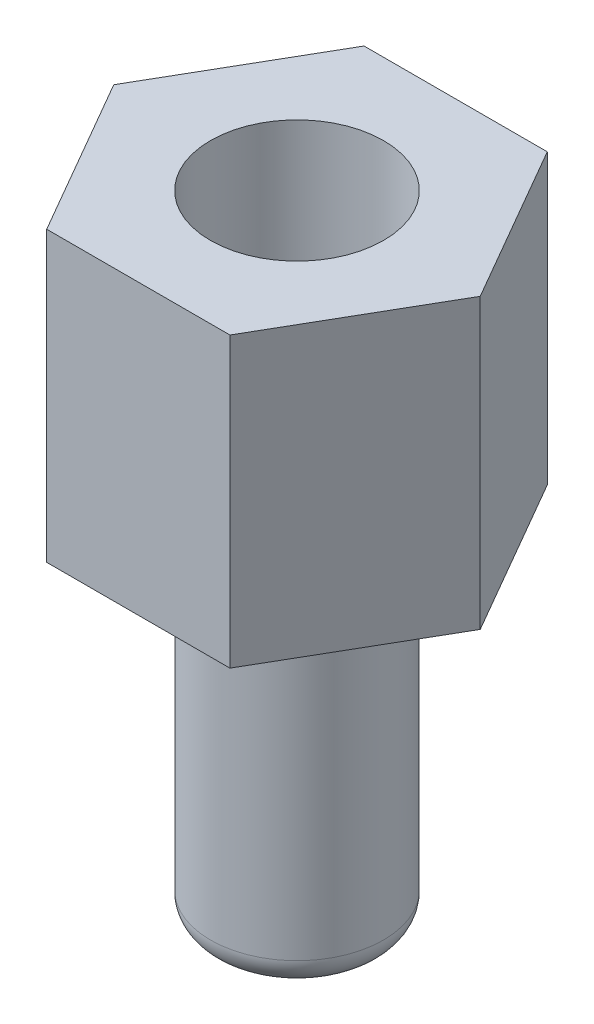
ISO-10303-21;
HEADER;
FILE_DESCRIPTION(('STEP AP214'),'2;1');
FILE_NAME('part.step','',(''),(''),'','','');
FILE_SCHEMA(('AUTOMOTIVE_DESIGN { 1 0 10303 214 1 1 1 1 }'));
ENDSEC;
DATA;
#1=APPLICATION_CONTEXT('core data for automotive mechanical design processes');
#2=APPLICATION_PROTOCOL_DEFINITION('international standard','automotive_design',2000,#1);
#3=PRODUCT_CONTEXT('',#1,'mechanical');
#4=PRODUCT('Part','Part','',(#3));
#5=PRODUCT_RELATED_PRODUCT_CATEGORY('part','',(#4));
#6=PRODUCT_DEFINITION_FORMATION('','',#4);
#7=PRODUCT_DEFINITION_CONTEXT('part definition',#1,'design');
#8=PRODUCT_DEFINITION('design','',#6,#7);
#9=PRODUCT_DEFINITION_SHAPE('','',#8);
#10=(LENGTH_UNIT() NAMED_UNIT(*) SI_UNIT(.MILLI.,.METRE.));
#11=(NAMED_UNIT(*) PLANE_ANGLE_UNIT() SI_UNIT($,.RADIAN.));
#12=(NAMED_UNIT(*) SI_UNIT($,.STERADIAN.) SOLID_ANGLE_UNIT());
#13=UNCERTAINTY_MEASURE_WITH_UNIT(LENGTH_MEASURE(1.E-05),#10,'distance_accuracy_value','');
#14=(GEOMETRIC_REPRESENTATION_CONTEXT(3) GLOBAL_UNCERTAINTY_ASSIGNED_CONTEXT((#13)) GLOBAL_UNIT_ASSIGNED_CONTEXT((#10,
#11,#12)) REPRESENTATION_CONTEXT('',''));
#15=CARTESIAN_POINT('',(0.,0.,0.));
#16=DIRECTION('',(0.,0.,1.));
#17=DIRECTION('',(1.,0.,0.));
#18=AXIS2_PLACEMENT_3D('',#15,#16,#17);
#19=CARTESIAN_POINT('',(0.,0.,0.));
#20=DIRECTION('',(0.,1.,0.));
#21=DIRECTION('',(0.,0.,1.));
#22=AXIS2_PLACEMENT_3D('',#19,#20,#21);
#23=PLANE('',#22);
#24=DIRECTION('',(0.5,0.,-0.866025403784439));
#25=VECTOR('',#24,1.);
#26=CARTESIAN_POINT('',(1.58771324027146,0.,2.75000000000001));
#27=LINE('',#26,#25);
#28=CARTESIAN_POINT('',(1.58771324027146,0.,2.75000000000001));
#29=VERTEX_POINT('',#28);
#30=CARTESIAN_POINT('',(3.17542648054294,0.,0.));
#31=VERTEX_POINT('',#30);
#32=EDGE_CURVE('E119',#29,#31,#27,.T.);
#33=ORIENTED_EDGE('',*,*,#32,.F.);
#34=DIRECTION('',(1.,0.,0.));
#35=VECTOR('',#34,1.);
#36=CARTESIAN_POINT('',(-1.58771324027148,0.,2.75000000000001));
#37=LINE('',#36,#35);
#38=CARTESIAN_POINT('',(-1.58771324027148,0.,2.75000000000001));
#39=VERTEX_POINT('',#38);
#40=EDGE_CURVE('E79',#39,#29,#37,.T.);
#41=ORIENTED_EDGE('',*,*,#40,.F.);
#42=DIRECTION('',(0.5,0.,0.866025403784439));
#43=VECTOR('',#42,1.);
#44=CARTESIAN_POINT('',(-3.17542648054295,0.,0.));
#45=LINE('',#44,#43);
#46=CARTESIAN_POINT('',(-3.17542648054295,0.,0.));
#47=VERTEX_POINT('',#46);
#48=EDGE_CURVE('E73',#47,#39,#45,.T.);
#49=ORIENTED_EDGE('',*,*,#48,.F.);
#50=DIRECTION('',(-0.500000000000001,0.,0.866025403784438));
#51=VECTOR('',#50,1.);
#52=CARTESIAN_POINT('',(-1.58771324027147,0.,-2.75));
#53=LINE('',#52,#51);
#54=CARTESIAN_POINT('',(-1.58771324027147,0.,-2.75));
#55=VERTEX_POINT('',#54);
#56=EDGE_CURVE('E109',#55,#47,#53,.T.);
#57=ORIENTED_EDGE('',*,*,#56,.F.);
#58=DIRECTION('',(-1.,0.,0.));
#59=VECTOR('',#58,1.);
#60=CARTESIAN_POINT('',(1.58771324027146,0.,-2.75));
#61=LINE('',#60,#59);
#62=CARTESIAN_POINT('',(1.58771324027146,0.,-2.75));
#63=VERTEX_POINT('',#62);
#64=EDGE_CURVE('E125',#63,#55,#61,.T.);
#65=ORIENTED_EDGE('',*,*,#64,.F.);
#66=DIRECTION('',(-0.500000000000001,0.,-0.866025403784438));
#67=VECTOR('',#66,1.);
#68=CARTESIAN_POINT('',(3.17542648054294,0.,0.));
#69=LINE('',#68,#67);
#70=EDGE_CURVE('E122',#31,#63,#69,.T.);
#71=ORIENTED_EDGE('',*,*,#70,.F.);
#72=EDGE_LOOP('',(#33,#41,#49,#57,#65,#71));
#73=FACE_BOUND('',#72,.T.);
#74=CARTESIAN_POINT('',(0.,0.,0.));
#75=DIRECTION('',(0.,1.,0.));
#76=DIRECTION('',(0.,0.,1.));
#77=AXIS2_PLACEMENT_3D('',#74,#75,#76);
#78=CIRCLE('',#77,1.5);
#79=CARTESIAN_POINT('',(0.,0.,1.5));
#80=VERTEX_POINT('',#79);
#81=EDGE_CURVE('E139',#80,#80,#78,.F.);
#82=ORIENTED_EDGE('',*,*,#81,.F.);
#83=EDGE_LOOP('',(#82));
#84=FACE_BOUND('',#83,.T.);
#85=ADVANCED_FACE('F33',(#73,#84),#23,.F.);
#86=CARTESIAN_POINT('',(1.58771324027146,5.,2.75000000000001));
#87=DIRECTION('',(-0.866025403784438,0.,-0.5));
#88=DIRECTION('',(-0.5,0.,0.866025403784438));
#89=AXIS2_PLACEMENT_3D('',#86,#87,#88);
#90=PLANE('',#89);
#91=ORIENTED_EDGE('',*,*,#32,.T.);
#92=DIRECTION('',(0.,-1.,0.));
#93=VECTOR('',#92,1.);
#94=CARTESIAN_POINT('',(3.17542648054294,5.,0.));
#95=LINE('',#94,#93);
#96=CARTESIAN_POINT('',(3.17542648054294,5.,0.));
#97=VERTEX_POINT('',#96);
#98=EDGE_CURVE('E137',#97,#31,#95,.T.);
#99=ORIENTED_EDGE('',*,*,#98,.F.);
#100=DIRECTION('',(0.5,0.,-0.866025403784439));
#101=VECTOR('',#100,1.);
#102=CARTESIAN_POINT('',(1.58771324027146,5.,2.75000000000001));
#103=LINE('',#102,#101);
#104=CARTESIAN_POINT('',(1.58771324027146,5.,2.75000000000001));
#105=VERTEX_POINT('',#104);
#106=EDGE_CURVE('E130',#105,#97,#103,.T.);
#107=ORIENTED_EDGE('',*,*,#106,.F.);
#108=DIRECTION('',(0.,-1.,0.));
#109=VECTOR('',#108,1.);
#110=CARTESIAN_POINT('',(1.58771324027146,5.,2.75000000000001));
#111=LINE('',#110,#109);
#112=EDGE_CURVE('E115',#105,#29,#111,.T.);
#113=ORIENTED_EDGE('',*,*,#112,.T.);
#114=EDGE_LOOP('',(#91,#99,#107,#113));
#115=FACE_BOUND('',#114,.T.);
#116=ADVANCED_FACE('F160',(#115),#90,.F.);
#117=CARTESIAN_POINT('',(3.17542648054294,5.,0.));
#118=DIRECTION('',(-0.866025403784438,0.,0.500000000000001));
#119=DIRECTION('',(0.500000000000001,0.,0.866025403784438));
#120=AXIS2_PLACEMENT_3D('',#117,#118,#119);
#121=PLANE('',#120);
#122=ORIENTED_EDGE('',*,*,#70,.T.);
#123=DIRECTION('',(0.,-1.,0.));
#124=VECTOR('',#123,1.);
#125=CARTESIAN_POINT('',(1.58771324027146,5.,-2.75));
#126=LINE('',#125,#124);
#127=CARTESIAN_POINT('',(1.58771324027146,5.,-2.75));
#128=VERTEX_POINT('',#127);
#129=EDGE_CURVE('E134',#128,#63,#126,.T.);
#130=ORIENTED_EDGE('',*,*,#129,.F.);
#131=DIRECTION('',(-0.500000000000001,0.,-0.866025403784438));
#132=VECTOR('',#131,1.);
#133=CARTESIAN_POINT('',(3.17542648054294,5.,0.));
#134=LINE('',#133,#132);
#135=EDGE_CURVE('E88',#97,#128,#134,.T.);
#136=ORIENTED_EDGE('',*,*,#135,.F.);
#137=ORIENTED_EDGE('',*,*,#98,.T.);
#138=EDGE_LOOP('',(#122,#130,#136,#137));
#139=FACE_BOUND('',#138,.T.);
#140=ADVANCED_FACE('F166',(#139),#121,.F.);
#141=CARTESIAN_POINT('',(1.58771324027146,5.,-2.75));
#142=DIRECTION('',(0.,0.,1.));
#143=DIRECTION('',(1.,0.,0.));
#144=AXIS2_PLACEMENT_3D('',#141,#142,#143);
#145=PLANE('',#144);
#146=ORIENTED_EDGE('',*,*,#64,.T.);
#147=DIRECTION('',(0.,-1.,0.));
#148=VECTOR('',#147,1.);
#149=CARTESIAN_POINT('',(-1.58771324027147,5.,-2.75));
#150=LINE('',#149,#148);
#151=CARTESIAN_POINT('',(-1.58771324027147,5.,-2.75));
#152=VERTEX_POINT('',#151);
#153=EDGE_CURVE('E110',#152,#55,#150,.T.);
#154=ORIENTED_EDGE('',*,*,#153,.F.);
#155=DIRECTION('',(-1.,0.,0.));
#156=VECTOR('',#155,1.);
#157=CARTESIAN_POINT('',(1.58771324027146,5.,-2.75));
#158=LINE('',#157,#156);
#159=EDGE_CURVE('E101',#128,#152,#158,.T.);
#160=ORIENTED_EDGE('',*,*,#159,.F.);
#161=ORIENTED_EDGE('',*,*,#129,.T.);
#162=EDGE_LOOP('',(#146,#154,#160,#161));
#163=FACE_BOUND('',#162,.T.);
#164=ADVANCED_FACE('F180',(#163),#145,.F.);
#165=CARTESIAN_POINT('',(-1.58771324027147,5.,-2.75));
#166=DIRECTION('',(0.866025403784438,0.,0.500000000000001));
#167=DIRECTION('',(0.500000000000001,0.,-0.866025403784438));
#168=AXIS2_PLACEMENT_3D('',#165,#166,#167);
#169=PLANE('',#168);
#170=ORIENTED_EDGE('',*,*,#56,.T.);
#171=DIRECTION('',(0.,-1.,0.));
#172=VECTOR('',#171,1.);
#173=CARTESIAN_POINT('',(-3.17542648054295,5.,0.));
#174=LINE('',#173,#172);
#175=CARTESIAN_POINT('',(-3.17542648054295,5.,0.));
#176=VERTEX_POINT('',#175);
#177=EDGE_CURVE('E106',#176,#47,#174,.T.);
#178=ORIENTED_EDGE('',*,*,#177,.F.);
#179=DIRECTION('',(-0.500000000000001,0.,0.866025403784438));
#180=VECTOR('',#179,1.);
#181=CARTESIAN_POINT('',(-1.58771324027147,5.,-2.75));
#182=LINE('',#181,#180);
#183=EDGE_CURVE('E95',#152,#176,#182,.T.);
#184=ORIENTED_EDGE('',*,*,#183,.F.);
#185=ORIENTED_EDGE('',*,*,#153,.T.);
#186=EDGE_LOOP('',(#170,#178,#184,#185));
#187=FACE_BOUND('',#186,.T.);
#188=ADVANCED_FACE('F107',(#187),#169,.F.);
#189=CARTESIAN_POINT('',(-3.17542648054295,5.,0.));
#190=DIRECTION('',(0.866025403784439,0.,-0.5));
#191=DIRECTION('',(-0.5,0.,-0.866025403784439));
#192=AXIS2_PLACEMENT_3D('',#189,#190,#191);
#193=PLANE('',#192);
#194=ORIENTED_EDGE('',*,*,#48,.T.);
#195=DIRECTION('',(0.,-1.,0.));
#196=VECTOR('',#195,1.);
#197=CARTESIAN_POINT('',(-1.58771324027148,5.,2.75000000000001));
#198=LINE('',#197,#196);
#199=CARTESIAN_POINT('',(-1.58771324027148,5.,2.75000000000001));
#200=VERTEX_POINT('',#199);
#201=EDGE_CURVE('E111',#200,#39,#198,.T.);
#202=ORIENTED_EDGE('',*,*,#201,.F.);
#203=DIRECTION('',(0.5,0.,0.866025403784439));
#204=VECTOR('',#203,1.);
#205=CARTESIAN_POINT('',(-3.17542648054295,5.,0.));
#206=LINE('',#205,#204);
#207=EDGE_CURVE('E99',#176,#200,#206,.T.);
#208=ORIENTED_EDGE('',*,*,#207,.F.);
#209=ORIENTED_EDGE('',*,*,#177,.T.);
#210=EDGE_LOOP('',(#194,#202,#208,#209));
#211=FACE_BOUND('',#210,.T.);
#212=ADVANCED_FACE('F113',(#211),#193,.F.);
#213=CARTESIAN_POINT('',(-1.58771324027148,5.,2.75000000000001));
#214=DIRECTION('',(0.,0.,-1.));
#215=DIRECTION('',(-1.,0.,0.));
#216=AXIS2_PLACEMENT_3D('',#213,#214,#215);
#217=PLANE('',#216);
#218=ORIENTED_EDGE('',*,*,#40,.T.);
#219=ORIENTED_EDGE('',*,*,#112,.F.);
#220=DIRECTION('',(1.,0.,0.));
#221=VECTOR('',#220,1.);
#222=CARTESIAN_POINT('',(-1.58771324027148,5.,2.75000000000001));
#223=LINE('',#222,#221);
#224=EDGE_CURVE('E50',#200,#105,#223,.T.);
#225=ORIENTED_EDGE('',*,*,#224,.F.);
#226=ORIENTED_EDGE('',*,*,#201,.T.);
#227=EDGE_LOOP('',(#218,#219,#225,#226));
#228=FACE_BOUND('',#227,.T.);
#229=ADVANCED_FACE('F173',(#228),#217,.F.);
#230=CARTESIAN_POINT('',(0.,5.,0.));
#231=DIRECTION('',(0.,1.,0.));
#232=DIRECTION('',(0.,0.,1.));
#233=AXIS2_PLACEMENT_3D('',#230,#231,#232);
#234=PLANE('',#233);
#235=CARTESIAN_POINT('',(0.,5.,0.));
#236=DIRECTION('',(0.,1.,0.));
#237=DIRECTION('',(0.,0.,1.));
#238=AXIS2_PLACEMENT_3D('',#235,#236,#237);
#239=CIRCLE('',#238,1.5);
#240=CARTESIAN_POINT('',(0.,5.,1.5));
#241=VERTEX_POINT('',#240);
#242=EDGE_CURVE('E193',#241,#241,#239,.T.);
#243=ORIENTED_EDGE('',*,*,#242,.F.);
#244=EDGE_LOOP('',(#243));
#245=FACE_BOUND('',#244,.T.);
#246=ORIENTED_EDGE('',*,*,#106,.T.);
#247=ORIENTED_EDGE('',*,*,#135,.T.);
#248=ORIENTED_EDGE('',*,*,#159,.T.);
#249=ORIENTED_EDGE('',*,*,#183,.T.);
#250=ORIENTED_EDGE('',*,*,#207,.T.);
#251=ORIENTED_EDGE('',*,*,#224,.T.);
#252=EDGE_LOOP('',(#246,#247,#248,#249,#250,#251));
#253=FACE_BOUND('',#252,.T.);
#254=ADVANCED_FACE('F97',(#245,#253),#234,.T.);
#255=CARTESIAN_POINT('',(0.,-6.,0.));
#256=DIRECTION('',(0.,1.,0.));
#257=DIRECTION('',(0.,0.,1.));
#258=AXIS2_PLACEMENT_3D('',#255,#256,#257);
#259=CYLINDRICAL_SURFACE('',#258,1.5);
#260=CARTESIAN_POINT('',(0.,-5.5,0.));
#261=DIRECTION('',(0.,-1.,0.));
#262=DIRECTION('',(0.,0.,-1.));
#263=AXIS2_PLACEMENT_3D('',#260,#261,#262);
#264=CIRCLE('',#263,1.5);
#265=CARTESIAN_POINT('',(0.,-5.5,-1.5));
#266=VERTEX_POINT('',#265);
#267=EDGE_CURVE('E11',#266,#266,#264,.F.);
#268=ORIENTED_EDGE('',*,*,#267,.T.);
#269=EDGE_LOOP('',(#268));
#270=FACE_BOUND('',#269,.T.);
#271=ORIENTED_EDGE('',*,*,#81,.T.);
#272=EDGE_LOOP('',(#271));
#273=FACE_BOUND('',#272,.T.);
#274=ADVANCED_FACE('F156',(#270,#273),#259,.T.);
#275=CARTESIAN_POINT('',(0.,-6.,0.));
#276=DIRECTION('',(0.,-1.,0.));
#277=DIRECTION('',(0.,0.,-1.));
#278=AXIS2_PLACEMENT_3D('',#275,#276,#277);
#279=PLANE('',#278);
#280=CARTESIAN_POINT('',(0.,-6.,0.));
#281=DIRECTION('',(0.,-1.,0.));
#282=DIRECTION('',(0.,0.,-1.));
#283=AXIS2_PLACEMENT_3D('',#280,#281,#282);
#284=CIRCLE('',#283,1.);
#285=CARTESIAN_POINT('',(0.,-6.,-1.));
#286=VERTEX_POINT('',#285);
#287=EDGE_CURVE('E42',#286,#286,#284,.T.);
#288=ORIENTED_EDGE('',*,*,#287,.T.);
#289=EDGE_LOOP('',(#288));
#290=FACE_BOUND('',#289,.T.);
#291=ADVANCED_FACE('F144',(#290),#279,.T.);
#292=CARTESIAN_POINT('',(0.,-5.5,0.));
#293=DIRECTION('',(0.,-1.,0.));
#294=DIRECTION('',(0.,0.,-1.));
#295=AXIS2_PLACEMENT_3D('',#292,#293,#294);
#296=TOROIDAL_SURFACE('',#295,1.,0.5);
#297=ORIENTED_EDGE('',*,*,#267,.F.);
#298=EDGE_LOOP('',(#297));
#299=FACE_BOUND('',#298,.T.);
#300=ORIENTED_EDGE('',*,*,#287,.F.);
#301=EDGE_LOOP('',(#300));
#302=FACE_BOUND('',#301,.T.);
#303=ADVANCED_FACE('F35',(#299,#302),#296,.T.);
#304=CARTESIAN_POINT('',(0.,2.5,0.));
#305=DIRECTION('',(0.,1.,0.));
#306=DIRECTION('',(0.,0.,1.));
#307=AXIS2_PLACEMENT_3D('',#304,#305,#306);
#308=CYLINDRICAL_SURFACE('',#307,1.5);
#309=CARTESIAN_POINT('',(0.,2.5,0.));
#310=DIRECTION('',(0.,1.,0.));
#311=DIRECTION('',(0.,0.,1.));
#312=AXIS2_PLACEMENT_3D('',#309,#310,#311);
#313=CIRCLE('',#312,1.5);
#314=CARTESIAN_POINT('',(0.,2.5,1.5));
#315=VERTEX_POINT('',#314);
#316=EDGE_CURVE('E123',#315,#315,#313,.T.);
#317=ORIENTED_EDGE('',*,*,#316,.F.);
#318=EDGE_LOOP('',(#317));
#319=FACE_BOUND('',#318,.T.);
#320=ORIENTED_EDGE('',*,*,#242,.T.);
#321=EDGE_LOOP('',(#320));
#322=FACE_BOUND('',#321,.T.);
#323=ADVANCED_FACE('F147',(#319,#322),#308,.F.);
#324=CARTESIAN_POINT('',(0.,2.5,0.));
#325=DIRECTION('',(0.,1.,0.));
#326=DIRECTION('',(0.,0.,1.));
#327=AXIS2_PLACEMENT_3D('',#324,#325,#326);
#328=PLANE('',#327);
#329=ORIENTED_EDGE('',*,*,#316,.T.);
#330=EDGE_LOOP('',(#329));
#331=FACE_BOUND('',#330,.T.);
#332=ADVANCED_FACE('F153',(#331),#328,.T.);
#333=CLOSED_SHELL('',(#85,#116,#140,#164,#188,#212,#229,#254,#274,#291,#303,#323,#332));
#334=MANIFOLD_SOLID_BREP('B2',#333);
#335=ADVANCED_BREP_SHAPE_REPRESENTATION('',(#18,#334),#14);
#336=SHAPE_DEFINITION_REPRESENTATION(#9,#335);
ENDSEC;
END-ISO-10303-21;
